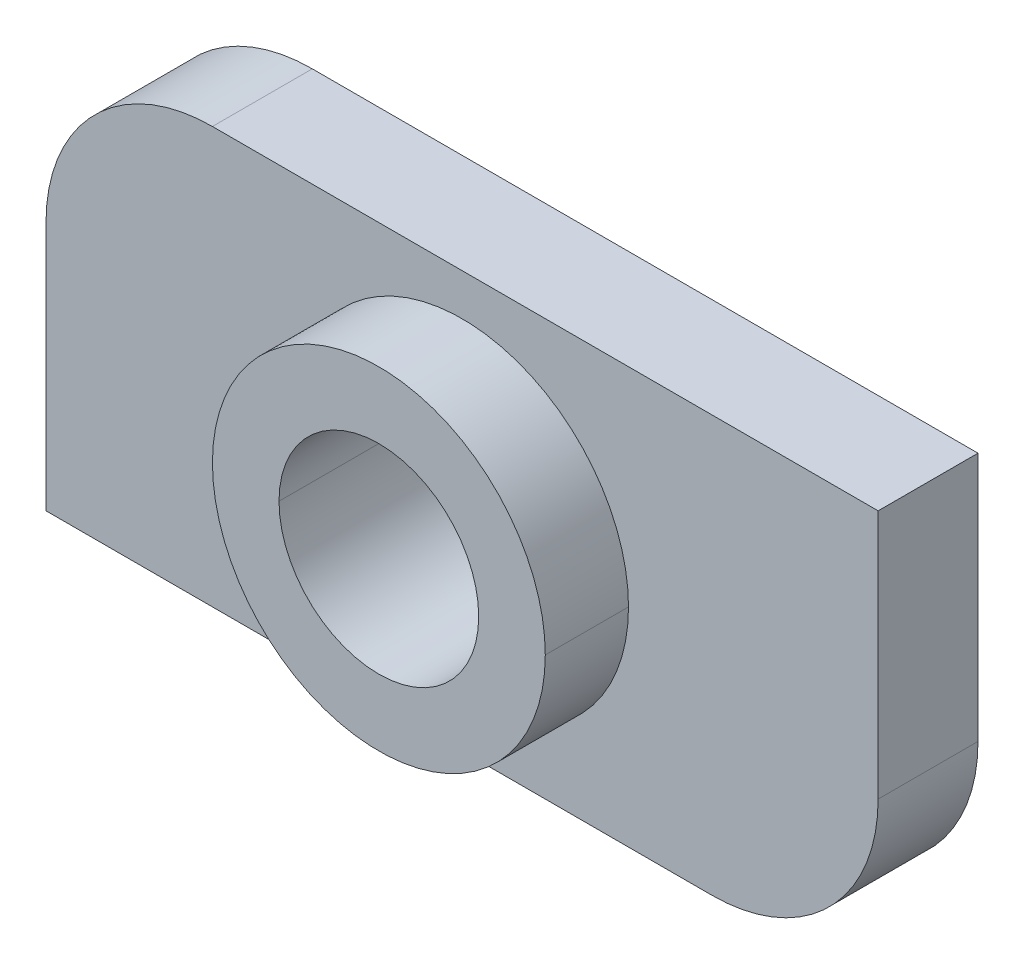
ISO-10303-21;
HEADER;
FILE_DESCRIPTION(('STEP AP214'),'2;1');
FILE_NAME('part.step','',(''),(''),'','','');
FILE_SCHEMA(('AUTOMOTIVE_DESIGN { 1 0 10303 214 1 1 1 1 }'));
ENDSEC;
DATA;
#1=APPLICATION_CONTEXT('core data for automotive mechanical design processes');
#2=APPLICATION_PROTOCOL_DEFINITION('international standard','automotive_design',2000,#1);
#3=PRODUCT_CONTEXT('',#1,'mechanical');
#4=PRODUCT('Part','Part','',(#3));
#5=PRODUCT_RELATED_PRODUCT_CATEGORY('part','',(#4));
#6=PRODUCT_DEFINITION_FORMATION('','',#4);
#7=PRODUCT_DEFINITION_CONTEXT('part definition',#1,'design');
#8=PRODUCT_DEFINITION('design','',#6,#7);
#9=PRODUCT_DEFINITION_SHAPE('','',#8);
#10=(LENGTH_UNIT() NAMED_UNIT(*) SI_UNIT(.MILLI.,.METRE.));
#11=(NAMED_UNIT(*) PLANE_ANGLE_UNIT() SI_UNIT($,.RADIAN.));
#12=(NAMED_UNIT(*) SI_UNIT($,.STERADIAN.) SOLID_ANGLE_UNIT());
#13=UNCERTAINTY_MEASURE_WITH_UNIT(LENGTH_MEASURE(1.E-05),#10,'distance_accuracy_value','');
#14=(GEOMETRIC_REPRESENTATION_CONTEXT(3) GLOBAL_UNCERTAINTY_ASSIGNED_CONTEXT((#13)) GLOBAL_UNIT_ASSIGNED_CONTEXT((#10,
#11,#12)) REPRESENTATION_CONTEXT('',''));
#15=CARTESIAN_POINT('',(0.,0.,0.));
#16=DIRECTION('',(0.,0.,1.));
#17=DIRECTION('',(1.,0.,0.));
#18=AXIS2_PLACEMENT_3D('',#15,#16,#17);
#19=CARTESIAN_POINT('',(0.,0.,2.2));
#20=DIRECTION('',(0.,0.,-1.));
#21=DIRECTION('',(-1.,0.,0.));
#22=AXIS2_PLACEMENT_3D('',#19,#20,#21);
#23=CYLINDRICAL_SURFACE('',#22,2.);
#24=CARTESIAN_POINT('',(0.,0.,1.2));
#25=DIRECTION('',(0.,0.,-1.));
#26=DIRECTION('',(-1.,0.,0.));
#27=AXIS2_PLACEMENT_3D('',#24,#25,#26);
#28=CIRCLE('',#27,2.);
#29=CARTESIAN_POINT('',(-2.,0.,1.2));
#30=VERTEX_POINT('',#29);
#31=CARTESIAN_POINT('',(2.,0.,1.2));
#32=VERTEX_POINT('',#31);
#33=EDGE_CURVE('E103',#30,#32,#28,.T.);
#34=ORIENTED_EDGE('',*,*,#33,.F.);
#35=DIRECTION('',(0.,0.,-1.));
#36=VECTOR('',#35,1.);
#37=CARTESIAN_POINT('',(-2.,0.,2.2));
#38=LINE('',#37,#36);
#39=CARTESIAN_POINT('',(-2.,0.,2.2));
#40=VERTEX_POINT('',#39);
#41=EDGE_CURVE('E86',#40,#30,#38,.T.);
#42=ORIENTED_EDGE('',*,*,#41,.F.);
#43=CARTESIAN_POINT('',(0.,0.,2.2));
#44=DIRECTION('',(0.,0.,-1.));
#45=DIRECTION('',(-1.,0.,0.));
#46=AXIS2_PLACEMENT_3D('',#43,#44,#45);
#47=CIRCLE('',#46,2.);
#48=CARTESIAN_POINT('',(2.,0.,2.2));
#49=VERTEX_POINT('',#48);
#50=EDGE_CURVE('E102',#49,#40,#47,.F.);
#51=ORIENTED_EDGE('',*,*,#50,.F.);
#52=DIRECTION('',(0.,0.,-1.));
#53=VECTOR('',#52,1.);
#54=CARTESIAN_POINT('',(2.,0.,2.2));
#55=LINE('',#54,#53);
#56=EDGE_CURVE('E93',#32,#49,#55,.F.);
#57=ORIENTED_EDGE('',*,*,#56,.F.);
#58=EDGE_LOOP('',(#34,#42,#51,#57));
#59=FACE_BOUND('',#58,.T.);
#60=ADVANCED_FACE('F17',(#59),#23,.T.);
#61=CARTESIAN_POINT('',(0.,0.,2.2));
#62=DIRECTION('',(0.,0.,-1.));
#63=DIRECTION('',(-1.,0.,0.));
#64=AXIS2_PLACEMENT_3D('',#61,#62,#63);
#65=CYLINDRICAL_SURFACE('',#64,2.);
#66=ORIENTED_EDGE('',*,*,#41,.T.);
#67=CARTESIAN_POINT('',(0.,0.,1.2));
#68=DIRECTION('',(0.,0.,-1.));
#69=DIRECTION('',(-1.,0.,0.));
#70=AXIS2_PLACEMENT_3D('',#67,#68,#69);
#71=CIRCLE('',#70,2.);
#72=EDGE_CURVE('E97',#32,#30,#71,.T.);
#73=ORIENTED_EDGE('',*,*,#72,.F.);
#74=ORIENTED_EDGE('',*,*,#56,.T.);
#75=CARTESIAN_POINT('',(0.,0.,2.2));
#76=DIRECTION('',(0.,0.,-1.));
#77=DIRECTION('',(-1.,0.,0.));
#78=AXIS2_PLACEMENT_3D('',#75,#76,#77);
#79=CIRCLE('',#78,2.);
#80=EDGE_CURVE('E20',#40,#49,#79,.F.);
#81=ORIENTED_EDGE('',*,*,#80,.F.);
#82=EDGE_LOOP('',(#66,#73,#74,#81));
#83=FACE_BOUND('',#82,.T.);
#84=ADVANCED_FACE('F95',(#83),#65,.T.);
#85=CARTESIAN_POINT('',(0.,0.,2.2));
#86=DIRECTION('',(0.,0.,1.));
#87=DIRECTION('',(1.,0.,0.));
#88=AXIS2_PLACEMENT_3D('',#85,#86,#87);
#89=PLANE('',#88);
#90=ORIENTED_EDGE('',*,*,#80,.T.);
#91=ORIENTED_EDGE('',*,*,#50,.T.);
#92=EDGE_LOOP('',(#90,#91));
#93=FACE_BOUND('',#92,.T.);
#94=CARTESIAN_POINT('',(0.,0.,2.2));
#95=DIRECTION('',(0.,0.,-1.));
#96=DIRECTION('',(-1.,0.,0.));
#97=AXIS2_PLACEMENT_3D('',#94,#95,#96);
#98=CIRCLE('',#97,1.2);
#99=CARTESIAN_POINT('',(-1.2,0.,2.2));
#100=VERTEX_POINT('',#99);
#101=CARTESIAN_POINT('',(1.2,0.,2.2));
#102=VERTEX_POINT('',#101);
#103=EDGE_CURVE('E110',#100,#102,#98,.T.);
#104=ORIENTED_EDGE('',*,*,#103,.T.);
#105=CARTESIAN_POINT('',(0.,0.,2.2));
#106=DIRECTION('',(0.,0.,-1.));
#107=DIRECTION('',(-1.,0.,0.));
#108=AXIS2_PLACEMENT_3D('',#105,#106,#107);
#109=CIRCLE('',#108,1.2);
#110=EDGE_CURVE('E107',#102,#100,#109,.T.);
#111=ORIENTED_EDGE('',*,*,#110,.T.);
#112=EDGE_LOOP('',(#104,#111));
#113=FACE_BOUND('',#112,.T.);
#114=ADVANCED_FACE('F100',(#93,#113),#89,.T.);
#115=CARTESIAN_POINT('',(-5.,-2.5,1.2));
#116=DIRECTION('',(0.,0.,1.));
#117=DIRECTION('',(1.,0.,0.));
#118=AXIS2_PLACEMENT_3D('',#115,#116,#117);
#119=PLANE('',#118);
#120=DIRECTION('',(0.,-1.,0.));
#121=VECTOR('',#120,1.);
#122=CARTESIAN_POINT('',(5.,2.5,1.2));
#123=LINE('',#122,#121);
#124=CARTESIAN_POINT('',(5.,-0.5,1.2));
#125=VERTEX_POINT('',#124);
#126=CARTESIAN_POINT('',(5.,2.5,1.2));
#127=VERTEX_POINT('',#126);
#128=EDGE_CURVE('E147',#125,#127,#123,.F.);
#129=ORIENTED_EDGE('',*,*,#128,.T.);
#130=DIRECTION('',(1.,0.,0.));
#131=VECTOR('',#130,1.);
#132=CARTESIAN_POINT('',(-5.,2.5,1.2));
#133=LINE('',#132,#131);
#134=CARTESIAN_POINT('',(-3.,2.5,1.2));
#135=VERTEX_POINT('',#134);
#136=EDGE_CURVE('E117',#127,#135,#133,.F.);
#137=ORIENTED_EDGE('',*,*,#136,.T.);
#138=CARTESIAN_POINT('',(-3.,0.5,1.2));
#139=DIRECTION('',(0.,0.,-1.));
#140=DIRECTION('',(-1.,0.,0.));
#141=AXIS2_PLACEMENT_3D('',#138,#139,#140);
#142=CIRCLE('',#141,2.);
#143=CARTESIAN_POINT('',(-5.,0.499999999999999,1.2));
#144=VERTEX_POINT('',#143);
#145=EDGE_CURVE('E114',#144,#135,#142,.T.);
#146=ORIENTED_EDGE('',*,*,#145,.F.);
#147=DIRECTION('',(0.,1.,0.));
#148=VECTOR('',#147,1.);
#149=CARTESIAN_POINT('',(-5.,2.5,1.2));
#150=LINE('',#149,#148);
#151=CARTESIAN_POINT('',(-5.,-2.5,1.2));
#152=VERTEX_POINT('',#151);
#153=EDGE_CURVE('E141',#144,#152,#150,.F.);
#154=ORIENTED_EDGE('',*,*,#153,.T.);
#155=DIRECTION('',(1.,0.,0.));
#156=VECTOR('',#155,1.);
#157=CARTESIAN_POINT('',(-5.,-2.5,1.2));
#158=LINE('',#157,#156);
#159=CARTESIAN_POINT('',(3.,-2.5,1.2));
#160=VERTEX_POINT('',#159);
#161=EDGE_CURVE('E152',#152,#160,#158,.T.);
#162=ORIENTED_EDGE('',*,*,#161,.T.);
#163=CARTESIAN_POINT('',(3.,-0.5,1.2));
#164=DIRECTION('',(0.,0.,-1.));
#165=DIRECTION('',(-1.,0.,0.));
#166=AXIS2_PLACEMENT_3D('',#163,#164,#165);
#167=CIRCLE('',#166,2.);
#168=EDGE_CURVE('E118',#125,#160,#167,.T.);
#169=ORIENTED_EDGE('',*,*,#168,.F.);
#170=EDGE_LOOP('',(#129,#137,#146,#154,#162,#169));
#171=FACE_BOUND('',#170,.T.);
#172=ORIENTED_EDGE('',*,*,#33,.T.);
#173=ORIENTED_EDGE('',*,*,#72,.T.);
#174=EDGE_LOOP('',(#172,#173));
#175=FACE_BOUND('',#174,.T.);
#176=ADVANCED_FACE('F214',(#171,#175),#119,.T.);
#177=CARTESIAN_POINT('',(0.,0.,1.2));
#178=DIRECTION('',(0.,0.,-1.));
#179=DIRECTION('',(-1.,0.,0.));
#180=AXIS2_PLACEMENT_3D('',#177,#178,#179);
#181=CYLINDRICAL_SURFACE('',#180,1.2);
#182=DIRECTION('',(0.,0.,-1.));
#183=VECTOR('',#182,1.);
#184=CARTESIAN_POINT('',(1.2,0.,1.2));
#185=LINE('',#184,#183);
#186=CARTESIAN_POINT('',(1.2,0.,0.));
#187=VERTEX_POINT('',#186);
#188=EDGE_CURVE('E113',#102,#187,#185,.T.);
#189=ORIENTED_EDGE('',*,*,#188,.T.);
#190=CARTESIAN_POINT('',(0.,0.,0.));
#191=DIRECTION('',(0.,0.,-1.));
#192=DIRECTION('',(-1.,0.,0.));
#193=AXIS2_PLACEMENT_3D('',#190,#191,#192);
#194=CIRCLE('',#193,1.2);
#195=CARTESIAN_POINT('',(-1.2,0.,0.));
#196=VERTEX_POINT('',#195);
#197=EDGE_CURVE('E121',#187,#196,#194,.T.);
#198=ORIENTED_EDGE('',*,*,#197,.T.);
#199=DIRECTION('',(0.,0.,-1.));
#200=VECTOR('',#199,1.);
#201=CARTESIAN_POINT('',(-1.2,0.,1.2));
#202=LINE('',#201,#200);
#203=EDGE_CURVE('E109',#196,#100,#202,.F.);
#204=ORIENTED_EDGE('',*,*,#203,.T.);
#205=ORIENTED_EDGE('',*,*,#110,.F.);
#206=EDGE_LOOP('',(#189,#198,#204,#205));
#207=FACE_BOUND('',#206,.T.);
#208=ADVANCED_FACE('F238',(#207),#181,.F.);
#209=CARTESIAN_POINT('',(0.,0.,1.2));
#210=DIRECTION('',(0.,0.,-1.));
#211=DIRECTION('',(-1.,0.,0.));
#212=AXIS2_PLACEMENT_3D('',#209,#210,#211);
#213=CYLINDRICAL_SURFACE('',#212,1.2);
#214=ORIENTED_EDGE('',*,*,#103,.F.);
#215=ORIENTED_EDGE('',*,*,#203,.F.);
#216=CARTESIAN_POINT('',(0.,0.,0.));
#217=DIRECTION('',(0.,0.,-1.));
#218=DIRECTION('',(-1.,0.,0.));
#219=AXIS2_PLACEMENT_3D('',#216,#217,#218);
#220=CIRCLE('',#219,1.2);
#221=EDGE_CURVE('E124',#196,#187,#220,.T.);
#222=ORIENTED_EDGE('',*,*,#221,.T.);
#223=ORIENTED_EDGE('',*,*,#188,.F.);
#224=EDGE_LOOP('',(#214,#215,#222,#223));
#225=FACE_BOUND('',#224,.T.);
#226=ADVANCED_FACE('F235',(#225),#213,.F.);
#227=CARTESIAN_POINT('',(5.,2.5,1.2));
#228=DIRECTION('',(-1.,0.,0.));
#229=DIRECTION('',(0.,-1.,0.));
#230=AXIS2_PLACEMENT_3D('',#227,#228,#229);
#231=PLANE('',#230);
#232=DIRECTION('',(0.,1.,0.));
#233=VECTOR('',#232,1.);
#234=CARTESIAN_POINT('',(5.,-2.5,0.));
#235=LINE('',#234,#233);
#236=CARTESIAN_POINT('',(5.,-0.5,0.));
#237=VERTEX_POINT('',#236);
#238=CARTESIAN_POINT('',(5.,2.5,0.));
#239=VERTEX_POINT('',#238);
#240=EDGE_CURVE('E127',#237,#239,#235,.T.);
#241=ORIENTED_EDGE('',*,*,#240,.T.);
#242=DIRECTION('',(0.,0.,1.));
#243=VECTOR('',#242,1.);
#244=CARTESIAN_POINT('',(5.,2.5,1.2));
#245=LINE('',#244,#243);
#246=EDGE_CURVE('E138',#239,#127,#245,.T.);
#247=ORIENTED_EDGE('',*,*,#246,.T.);
#248=ORIENTED_EDGE('',*,*,#128,.F.);
#249=DIRECTION('',(0.,0.,-1.));
#250=VECTOR('',#249,1.);
#251=CARTESIAN_POINT('',(5.,-0.5,1.2));
#252=LINE('',#251,#250);
#253=EDGE_CURVE('E120',#237,#125,#252,.F.);
#254=ORIENTED_EDGE('',*,*,#253,.F.);
#255=EDGE_LOOP('',(#241,#247,#248,#254));
#256=FACE_BOUND('',#255,.T.);
#257=ADVANCED_FACE('F210',(#256),#231,.F.);
#258=CARTESIAN_POINT('',(-5.,2.5,1.2));
#259=DIRECTION('',(0.,-1.,0.));
#260=DIRECTION('',(1.,0.,0.));
#261=AXIS2_PLACEMENT_3D('',#258,#259,#260);
#262=PLANE('',#261);
#263=ORIENTED_EDGE('',*,*,#136,.F.);
#264=ORIENTED_EDGE('',*,*,#246,.F.);
#265=DIRECTION('',(1.,0.,0.));
#266=VECTOR('',#265,1.);
#267=CARTESIAN_POINT('',(-5.,2.5,0.));
#268=LINE('',#267,#266);
#269=CARTESIAN_POINT('',(-3.,2.5,0.));
#270=VERTEX_POINT('',#269);
#271=EDGE_CURVE('E131',#239,#270,#268,.F.);
#272=ORIENTED_EDGE('',*,*,#271,.T.);
#273=DIRECTION('',(0.,0.,-1.));
#274=VECTOR('',#273,1.);
#275=CARTESIAN_POINT('',(-3.,2.5,1.2));
#276=LINE('',#275,#274);
#277=EDGE_CURVE('E116',#135,#270,#276,.T.);
#278=ORIENTED_EDGE('',*,*,#277,.F.);
#279=EDGE_LOOP('',(#263,#264,#272,#278));
#280=FACE_BOUND('',#279,.T.);
#281=ADVANCED_FACE('F208',(#280),#262,.F.);
#282=CARTESIAN_POINT('',(-3.,0.5,1.2));
#283=DIRECTION('',(0.,0.,-1.));
#284=DIRECTION('',(-1.,0.,0.));
#285=AXIS2_PLACEMENT_3D('',#282,#283,#284);
#286=CYLINDRICAL_SURFACE('',#285,2.);
#287=ORIENTED_EDGE('',*,*,#145,.T.);
#288=ORIENTED_EDGE('',*,*,#277,.T.);
#289=CARTESIAN_POINT('',(-3.,0.5,0.));
#290=DIRECTION('',(0.,0.,-1.));
#291=DIRECTION('',(-1.,0.,0.));
#292=AXIS2_PLACEMENT_3D('',#289,#290,#291);
#293=CIRCLE('',#292,2.);
#294=CARTESIAN_POINT('',(-5.,0.5,0.));
#295=VERTEX_POINT('',#294);
#296=EDGE_CURVE('E128',#270,#295,#293,.F.);
#297=ORIENTED_EDGE('',*,*,#296,.T.);
#298=DIRECTION('',(0.,0.,1.));
#299=VECTOR('',#298,1.);
#300=CARTESIAN_POINT('',(-5.,0.5,1.2));
#301=LINE('',#300,#299);
#302=EDGE_CURVE('E144',#295,#144,#301,.T.);
#303=ORIENTED_EDGE('',*,*,#302,.T.);
#304=EDGE_LOOP('',(#287,#288,#297,#303));
#305=FACE_BOUND('',#304,.T.);
#306=ADVANCED_FACE('F202',(#305),#286,.T.);
#307=CARTESIAN_POINT('',(-5.,2.5,1.2));
#308=DIRECTION('',(1.,0.,0.));
#309=DIRECTION('',(0.,1.,0.));
#310=AXIS2_PLACEMENT_3D('',#307,#308,#309);
#311=PLANE('',#310);
#312=DIRECTION('',(0.,1.,0.));
#313=VECTOR('',#312,1.);
#314=CARTESIAN_POINT('',(-5.,-2.5,0.));
#315=LINE('',#314,#313);
#316=CARTESIAN_POINT('',(-5.,-2.5,0.));
#317=VERTEX_POINT('',#316);
#318=EDGE_CURVE('E130',#295,#317,#315,.F.);
#319=ORIENTED_EDGE('',*,*,#318,.T.);
#320=DIRECTION('',(0.,0.,1.));
#321=VECTOR('',#320,1.);
#322=CARTESIAN_POINT('',(-5.,-2.5,1.2));
#323=LINE('',#322,#321);
#324=EDGE_CURVE('E155',#317,#152,#323,.T.);
#325=ORIENTED_EDGE('',*,*,#324,.T.);
#326=ORIENTED_EDGE('',*,*,#153,.F.);
#327=ORIENTED_EDGE('',*,*,#302,.F.);
#328=EDGE_LOOP('',(#319,#325,#326,#327));
#329=FACE_BOUND('',#328,.T.);
#330=ADVANCED_FACE('F199',(#329),#311,.F.);
#331=CARTESIAN_POINT('',(-5.,-2.5,1.2));
#332=DIRECTION('',(0.,1.,0.));
#333=DIRECTION('',(0.,0.,1.));
#334=AXIS2_PLACEMENT_3D('',#331,#332,#333);
#335=PLANE('',#334);
#336=ORIENTED_EDGE('',*,*,#161,.F.);
#337=ORIENTED_EDGE('',*,*,#324,.F.);
#338=DIRECTION('',(1.,0.,0.));
#339=VECTOR('',#338,1.);
#340=CARTESIAN_POINT('',(-5.,-2.5,0.));
#341=LINE('',#340,#339);
#342=CARTESIAN_POINT('',(3.,-2.5,0.));
#343=VERTEX_POINT('',#342);
#344=EDGE_CURVE('E26',#317,#343,#341,.T.);
#345=ORIENTED_EDGE('',*,*,#344,.T.);
#346=DIRECTION('',(0.,0.,-1.));
#347=VECTOR('',#346,1.);
#348=CARTESIAN_POINT('',(3.,-2.5,1.2));
#349=LINE('',#348,#347);
#350=EDGE_CURVE('E34',#160,#343,#349,.T.);
#351=ORIENTED_EDGE('',*,*,#350,.F.);
#352=EDGE_LOOP('',(#336,#337,#345,#351));
#353=FACE_BOUND('',#352,.T.);
#354=ADVANCED_FACE('F192',(#353),#335,.F.);
#355=CARTESIAN_POINT('',(3.,-0.5,1.2));
#356=DIRECTION('',(0.,0.,-1.));
#357=DIRECTION('',(-1.,0.,0.));
#358=AXIS2_PLACEMENT_3D('',#355,#356,#357);
#359=CYLINDRICAL_SURFACE('',#358,2.);
#360=ORIENTED_EDGE('',*,*,#168,.T.);
#361=ORIENTED_EDGE('',*,*,#350,.T.);
#362=CARTESIAN_POINT('',(3.,-0.5,0.));
#363=DIRECTION('',(0.,0.,-1.));
#364=DIRECTION('',(-1.,0.,0.));
#365=AXIS2_PLACEMENT_3D('',#362,#363,#364);
#366=CIRCLE('',#365,2.);
#367=EDGE_CURVE('E11',#343,#237,#366,.F.);
#368=ORIENTED_EDGE('',*,*,#367,.T.);
#369=ORIENTED_EDGE('',*,*,#253,.T.);
#370=EDGE_LOOP('',(#360,#361,#368,#369));
#371=FACE_BOUND('',#370,.T.);
#372=ADVANCED_FACE('F216',(#371),#359,.T.);
#373=CARTESIAN_POINT('',(-5.,-2.5,0.));
#374=DIRECTION('',(0.,0.,1.));
#375=DIRECTION('',(1.,0.,0.));
#376=AXIS2_PLACEMENT_3D('',#373,#374,#375);
#377=PLANE('',#376);
#378=ORIENTED_EDGE('',*,*,#344,.F.);
#379=ORIENTED_EDGE('',*,*,#318,.F.);
#380=ORIENTED_EDGE('',*,*,#296,.F.);
#381=ORIENTED_EDGE('',*,*,#271,.F.);
#382=ORIENTED_EDGE('',*,*,#240,.F.);
#383=ORIENTED_EDGE('',*,*,#367,.F.);
#384=EDGE_LOOP('',(#378,#379,#380,#381,#382,#383));
#385=FACE_BOUND('',#384,.T.);
#386=ORIENTED_EDGE('',*,*,#197,.F.);
#387=ORIENTED_EDGE('',*,*,#221,.F.);
#388=EDGE_LOOP('',(#386,#387));
#389=FACE_BOUND('',#388,.T.);
#390=ADVANCED_FACE('F195',(#385,#389),#377,.F.);
#391=CLOSED_SHELL('',(#60,#84,#114,#176,#208,#226,#257,#281,#306,#330,#354,#372,#390));
#392=MANIFOLD_SOLID_BREP('B1',#391);
#393=ADVANCED_BREP_SHAPE_REPRESENTATION('',(#18,#392),#14);
#394=SHAPE_DEFINITION_REPRESENTATION(#9,#393);
ENDSEC;
END-ISO-10303-21;
